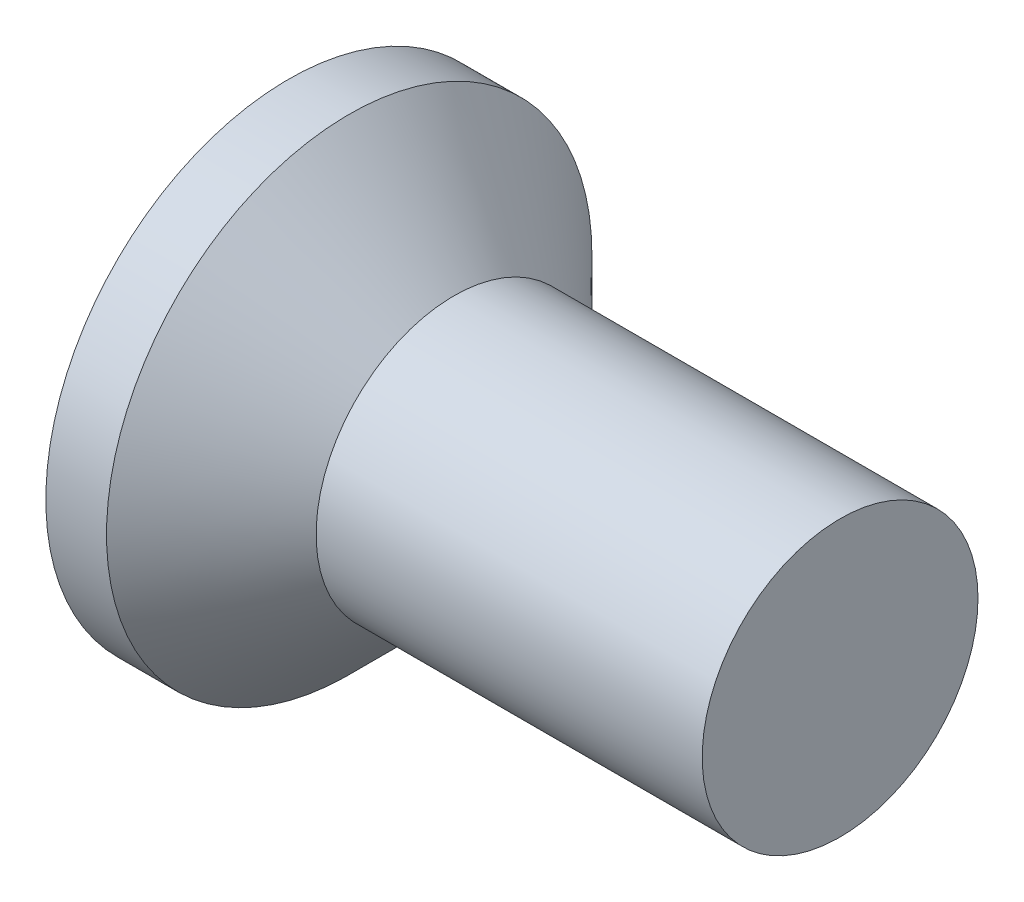
ISO-10303-21;
HEADER;
FILE_DESCRIPTION(('STEP AP214'),'2;1');
FILE_NAME('part.step','',(''),(''),'','','');
FILE_SCHEMA(('AUTOMOTIVE_DESIGN { 1 0 10303 214 1 1 1 1 }'));
ENDSEC;
DATA;
#1=APPLICATION_CONTEXT('core data for automotive mechanical design processes');
#2=APPLICATION_PROTOCOL_DEFINITION('international standard','automotive_design',2000,#1);
#3=PRODUCT_CONTEXT('',#1,'mechanical');
#4=PRODUCT('Part','Part','',(#3));
#5=PRODUCT_RELATED_PRODUCT_CATEGORY('part','',(#4));
#6=PRODUCT_DEFINITION_FORMATION('','',#4);
#7=PRODUCT_DEFINITION_CONTEXT('part definition',#1,'design');
#8=PRODUCT_DEFINITION('design','',#6,#7);
#9=PRODUCT_DEFINITION_SHAPE('','',#8);
#10=(LENGTH_UNIT() NAMED_UNIT(*) SI_UNIT(.MILLI.,.METRE.));
#11=(NAMED_UNIT(*) PLANE_ANGLE_UNIT() SI_UNIT($,.RADIAN.));
#12=(NAMED_UNIT(*) SI_UNIT($,.STERADIAN.) SOLID_ANGLE_UNIT());
#13=UNCERTAINTY_MEASURE_WITH_UNIT(LENGTH_MEASURE(1.E-05),#10,'distance_accuracy_value','');
#14=(GEOMETRIC_REPRESENTATION_CONTEXT(3) GLOBAL_UNCERTAINTY_ASSIGNED_CONTEXT((#13)) GLOBAL_UNIT_ASSIGNED_CONTEXT((#10,
#11,#12)) REPRESENTATION_CONTEXT('',''));
#15=CARTESIAN_POINT('',(0.,0.,0.));
#16=DIRECTION('',(0.,0.,1.));
#17=DIRECTION('',(1.,0.,0.));
#18=AXIS2_PLACEMENT_3D('',#15,#16,#17);
#19=CARTESIAN_POINT('',(0.,2.19999999999999,0.));
#20=DIRECTION('',(-1.,0.,0.));
#21=DIRECTION('',(0.,0.,1.));
#22=AXIS2_PLACEMENT_3D('',#19,#20,#21);
#23=PLANE('',#22);
#24=CARTESIAN_POINT('',(0.,0.,0.));
#25=DIRECTION('',(1.,0.,0.));
#26=DIRECTION('',(0.,0.,-1.));
#27=AXIS2_PLACEMENT_3D('',#24,#25,#26);
#28=CIRCLE('',#27,2.19999999999999);
#29=CARTESIAN_POINT('',(0.,0.,-2.20000000000004));
#30=VERTEX_POINT('',#29);
#31=EDGE_CURVE('E180',#30,#30,#28,.T.);
#32=ORIENTED_EDGE('',*,*,#31,.F.);
#33=EDGE_LOOP('',(#32));
#34=FACE_BOUND('',#33,.T.);
#35=DIRECTION('',(0.,1.,0.));
#36=VECTOR('',#35,1.);
#37=CARTESIAN_POINT('',(0.,-0.290000000000061,-0.289999999999957));
#38=LINE('',#37,#36);
#39=CARTESIAN_POINT('',(0.,-1.45000000000006,-0.289999999999957));
#40=VERTEX_POINT('',#39);
#41=CARTESIAN_POINT('',(0.,-0.590000000000018,-0.290000000000012));
#42=VERTEX_POINT('',#41);
#43=EDGE_CURVE('E284',#40,#42,#38,.T.);
#44=ORIENTED_EDGE('',*,*,#43,.T.);
#45=CARTESIAN_POINT('',(0.,-0.590000000000049,-0.589999999999952));
#46=DIRECTION('',(-1.,0.,0.));
#47=DIRECTION('',(0.,0.,1.));
#48=AXIS2_PLACEMENT_3D('',#45,#46,#47);
#49=CIRCLE('',#48,0.3);
#50=CARTESIAN_POINT('',(0.,-0.290000000000026,-0.590000000000035));
#51=VERTEX_POINT('',#50);
#52=EDGE_CURVE('E186',#42,#51,#49,.T.);
#53=ORIENTED_EDGE('',*,*,#52,.T.);
#54=DIRECTION('',(0.,0.,-1.));
#55=VECTOR('',#54,1.);
#56=CARTESIAN_POINT('',(0.,-0.290000000000061,-0.289999999999957));
#57=LINE('',#56,#55);
#58=CARTESIAN_POINT('',(0.,-0.290000000000026,-1.44999999999999));
#59=VERTEX_POINT('',#58);
#60=EDGE_CURVE('E279',#51,#59,#57,.T.);
#61=ORIENTED_EDGE('',*,*,#60,.T.);
#62=DIRECTION('',(0.,1.,0.));
#63=VECTOR('',#62,1.);
#64=CARTESIAN_POINT('',(0.,0.290000000000002,-1.45000000000002));
#65=LINE('',#64,#63);
#66=CARTESIAN_POINT('',(0.,0.290000000000002,-1.45000000000002));
#67=VERTEX_POINT('',#66);
#68=EDGE_CURVE('E243',#59,#67,#65,.T.);
#69=ORIENTED_EDGE('',*,*,#68,.T.);
#70=DIRECTION('',(0.,0.,1.));
#71=VECTOR('',#70,1.);
#72=CARTESIAN_POINT('',(0.,0.289999999999974,-0.289999999999943));
#73=LINE('',#72,#71);
#74=CARTESIAN_POINT('',(0.,0.289999999999964,-0.589999999999924));
#75=VERTEX_POINT('',#74);
#76=EDGE_CURVE('E233',#67,#75,#73,.T.);
#77=ORIENTED_EDGE('',*,*,#76,.T.);
#78=CARTESIAN_POINT('',(0.,0.589999999999969,-0.58999999999991));
#79=DIRECTION('',(-1.,0.,0.));
#80=DIRECTION('',(0.,0.,1.));
#81=AXIS2_PLACEMENT_3D('',#78,#79,#80);
#82=CIRCLE('',#81,0.3);
#83=CARTESIAN_POINT('',(0.,0.589999999999986,-0.290000000000026));
#84=VERTEX_POINT('',#83);
#85=EDGE_CURVE('E182',#75,#84,#82,.T.);
#86=ORIENTED_EDGE('',*,*,#85,.T.);
#87=DIRECTION('',(0.,1.,0.));
#88=VECTOR('',#87,1.);
#89=CARTESIAN_POINT('',(0.,0.289999999999974,-0.289999999999943));
#90=LINE('',#89,#88);
#91=CARTESIAN_POINT('',(0.,1.44999999999994,-0.289999999999985));
#92=VERTEX_POINT('',#91);
#93=EDGE_CURVE('E230',#84,#92,#90,.T.);
#94=ORIENTED_EDGE('',*,*,#93,.T.);
#95=DIRECTION('',(0.,0.,1.));
#96=VECTOR('',#95,1.);
#97=CARTESIAN_POINT('',(0.,1.44999999999994,-0.289999999999985));
#98=LINE('',#97,#96);
#99=CARTESIAN_POINT('',(0.,1.44999999999995,0.290000000000012));
#100=VERTEX_POINT('',#99);
#101=EDGE_CURVE('E239',#92,#100,#98,.T.);
#102=ORIENTED_EDGE('',*,*,#101,.T.);
#103=DIRECTION('',(0.,-1.00000000000001,0.));
#104=VECTOR('',#103,1.);
#105=CARTESIAN_POINT('',(0.,0.28999999999996,0.290000000000026));
#106=LINE('',#105,#104);
#107=CARTESIAN_POINT('',(0.,0.589999999999955,0.290000000000026));
#108=VERTEX_POINT('',#107);
#109=EDGE_CURVE('E241',#100,#108,#106,.T.);
#110=ORIENTED_EDGE('',*,*,#109,.T.);
#111=CARTESIAN_POINT('',(0.,0.589999999999976,0.590000000000021));
#112=DIRECTION('',(-1.,0.,0.));
#113=DIRECTION('',(0.,0.,1.));
#114=AXIS2_PLACEMENT_3D('',#111,#112,#113);
#115=CIRCLE('',#114,0.3);
#116=CARTESIAN_POINT('',(0.,0.289999999999978,0.589999999999993));
#117=VERTEX_POINT('',#116);
#118=EDGE_CURVE('E152',#108,#117,#115,.T.);
#119=ORIENTED_EDGE('',*,*,#118,.T.);
#120=DIRECTION('',(0.,0.,1.));
#121=VECTOR('',#120,1.);
#122=CARTESIAN_POINT('',(0.,0.28999999999996,0.290000000000026));
#123=LINE('',#122,#121);
#124=CARTESIAN_POINT('',(0.,0.289999999999981,1.45000000000001));
#125=VERTEX_POINT('',#124);
#126=EDGE_CURVE('E146',#117,#125,#123,.T.);
#127=ORIENTED_EDGE('',*,*,#126,.T.);
#128=DIRECTION('',(0.,-1.,0.));
#129=VECTOR('',#128,1.);
#130=CARTESIAN_POINT('',(0.,0.289999999999981,1.45000000000001));
#131=LINE('',#130,#129);
#132=CARTESIAN_POINT('',(0.,-0.290000000000068,1.45000000000003));
#133=VERTEX_POINT('',#132);
#134=EDGE_CURVE('E150',#125,#133,#131,.T.);
#135=ORIENTED_EDGE('',*,*,#134,.T.);
#136=DIRECTION('',(0.,0.,-1.));
#137=VECTOR('',#136,1.);
#138=CARTESIAN_POINT('',(0.,-0.290000000000037,0.290000000000068));
#139=LINE('',#138,#137);
#140=CARTESIAN_POINT('',(0.,-0.29000000000004,0.590000000000049));
#141=VERTEX_POINT('',#140);
#142=EDGE_CURVE('E162',#133,#141,#139,.T.);
#143=ORIENTED_EDGE('',*,*,#142,.T.);
#144=CARTESIAN_POINT('',(0.,-0.590000000000045,0.589999999999993));
#145=DIRECTION('',(-1.,0.,0.));
#146=DIRECTION('',(0.,0.,1.));
#147=AXIS2_PLACEMENT_3D('',#144,#145,#146);
#148=CIRCLE('',#147,0.3);
#149=CARTESIAN_POINT('',(0.,-0.590000000000077,0.289999999999999));
#150=VERTEX_POINT('',#149);
#151=EDGE_CURVE('E184',#141,#150,#148,.T.);
#152=ORIENTED_EDGE('',*,*,#151,.T.);
#153=DIRECTION('',(0.,-1.,0.));
#154=VECTOR('',#153,1.);
#155=CARTESIAN_POINT('',(0.,-0.290000000000037,0.290000000000068));
#156=LINE('',#155,#154);
#157=CARTESIAN_POINT('',(0.,-1.45,0.289999999999957));
#158=VERTEX_POINT('',#157);
#159=EDGE_CURVE('E291',#150,#158,#156,.T.);
#160=ORIENTED_EDGE('',*,*,#159,.T.);
#161=DIRECTION('',(0.,0.,-1.));
#162=VECTOR('',#161,1.);
#163=CARTESIAN_POINT('',(0.,-1.45000000000006,-0.289999999999957));
#164=LINE('',#163,#162);
#165=EDGE_CURVE('E288',#158,#40,#164,.T.);
#166=ORIENTED_EDGE('',*,*,#165,.T.);
#167=EDGE_LOOP('',(#44,#53,#61,#69,#77,#86,#94,#102,#110,#119,#127,#135,#143,#152,#160,#166));
#168=FACE_BOUND('',#167,.T.);
#169=ADVANCED_FACE('F34',(#34,#168),#23,.T.);
#170=CARTESIAN_POINT('',(4.99999999999999,1.24999999999996,0.));
#171=DIRECTION('',(1.,0.,0.));
#172=DIRECTION('',(0.,0.,-1.));
#173=AXIS2_PLACEMENT_3D('',#170,#171,#172);
#174=PLANE('',#173);
#175=CARTESIAN_POINT('',(4.99999999999999,0.,0.));
#176=DIRECTION('',(1.,0.,0.));
#177=DIRECTION('',(0.,0.,-1.));
#178=AXIS2_PLACEMENT_3D('',#175,#176,#177);
#179=CIRCLE('',#178,1.24999999999999);
#180=CARTESIAN_POINT('',(4.99999999999999,0.,-1.24999999999997));
#181=VERTEX_POINT('',#180);
#182=EDGE_CURVE('E167',#181,#181,#179,.T.);
#183=ORIENTED_EDGE('',*,*,#182,.T.);
#184=EDGE_LOOP('',(#183));
#185=FACE_BOUND('',#184,.T.);
#186=ADVANCED_FACE('F340',(#185),#174,.T.);
#187=CARTESIAN_POINT('',(4.51581291088132,0.,0.));
#188=DIRECTION('',(1.,0.,0.));
#189=DIRECTION('',(0.,0.,-1.));
#190=AXIS2_PLACEMENT_3D('',#187,#188,#189);
#191=CYLINDRICAL_SURFACE('',#190,2.19999999999999);
#192=ORIENTED_EDGE('',*,*,#31,.T.);
#193=EDGE_LOOP('',(#192));
#194=FACE_BOUND('',#193,.T.);
#195=CARTESIAN_POINT('',(0.550000000000002,0.,0.));
#196=DIRECTION('',(1.,0.,0.));
#197=DIRECTION('',(0.,0.,-1.));
#198=AXIS2_PLACEMENT_3D('',#195,#196,#197);
#199=CIRCLE('',#198,2.19999999999999);
#200=CARTESIAN_POINT('',(0.550000000000002,0.,-2.20000000000004));
#201=VERTEX_POINT('',#200);
#202=EDGE_CURVE('E250',#201,#201,#199,.T.);
#203=ORIENTED_EDGE('',*,*,#202,.F.);
#204=EDGE_LOOP('',(#203));
#205=FACE_BOUND('',#204,.T.);
#206=ADVANCED_FACE('F346',(#194,#205),#191,.T.);
#207=CARTESIAN_POINT('',(1.5,0.,0.));
#208=DIRECTION('',(-1.,0.,0.));
#209=DIRECTION('',(0.,0.,1.));
#210=AXIS2_PLACEMENT_3D('',#207,#208,#209);
#211=CONICAL_SURFACE('',#210,1.24999999999999,0.78539816339745);
#212=ORIENTED_EDGE('',*,*,#202,.T.);
#213=EDGE_LOOP('',(#212));
#214=FACE_BOUND('',#213,.T.);
#215=CARTESIAN_POINT('',(1.5,0.,0.));
#216=DIRECTION('',(1.,0.,0.));
#217=DIRECTION('',(0.,0.,-1.));
#218=AXIS2_PLACEMENT_3D('',#215,#216,#217);
#219=CIRCLE('',#218,1.24999999999999);
#220=CARTESIAN_POINT('',(1.5,0.,-1.25000000000003));
#221=VERTEX_POINT('',#220);
#222=EDGE_CURVE('E170',#221,#221,#219,.T.);
#223=ORIENTED_EDGE('',*,*,#222,.F.);
#224=EDGE_LOOP('',(#223));
#225=FACE_BOUND('',#224,.T.);
#226=ADVANCED_FACE('F485',(#214,#225),#211,.T.);
#227=CARTESIAN_POINT('',(4.51581291088132,0.,0.));
#228=DIRECTION('',(1.,0.,0.));
#229=DIRECTION('',(0.,0.,-1.));
#230=AXIS2_PLACEMENT_3D('',#227,#228,#229);
#231=CYLINDRICAL_SURFACE('',#230,1.24999999999999);
#232=ORIENTED_EDGE('',*,*,#182,.F.);
#233=EDGE_LOOP('',(#232));
#234=FACE_BOUND('',#233,.T.);
#235=ORIENTED_EDGE('',*,*,#222,.T.);
#236=EDGE_LOOP('',(#235));
#237=FACE_BOUND('',#236,.T.);
#238=ADVANCED_FACE('F475',(#234,#237),#231,.T.);
#239=CARTESIAN_POINT('',(0.750000000000001,0.289999999999954,0.29000000000004));
#240=DIRECTION('',(0.,-1.,0.));
#241=DIRECTION('',(0.,0.,-1.));
#242=AXIS2_PLACEMENT_3D('',#239,#240,#241);
#243=PLANE('',#242);
#244=ORIENTED_EDGE('',*,*,#126,.F.);
#245=DIRECTION('',(-1.,0.,0.));
#246=VECTOR('',#245,1.);
#247=CARTESIAN_POINT('',(0.750000000000001,0.289999999999978,0.589999999999993));
#248=LINE('',#247,#246);
#249=CARTESIAN_POINT('',(0.750000000000001,0.289999999999978,0.589999999999993));
#250=VERTEX_POINT('',#249);
#251=EDGE_CURVE('E49',#117,#250,#248,.F.);
#252=ORIENTED_EDGE('',*,*,#251,.T.);
#253=DIRECTION('',(0.,0.,1.));
#254=VECTOR('',#253,1.);
#255=CARTESIAN_POINT('',(0.750000000000001,0.289999999999954,0.29000000000004));
#256=LINE('',#255,#254);
#257=CARTESIAN_POINT('',(0.750000000000001,0.289999999999947,1.01698729810784));
#258=VERTEX_POINT('',#257);
#259=EDGE_CURVE('E165',#250,#258,#256,.T.);
#260=ORIENTED_EDGE('',*,*,#259,.T.);
#261=DIRECTION('',(-0.866025403784438,0.,0.500000000000002));
#262=VECTOR('',#261,1.);
#263=CARTESIAN_POINT('',(0.,0.289999999999981,1.45000000000001));
#264=LINE('',#263,#262);
#265=EDGE_CURVE('E158',#258,#125,#264,.T.);
#266=ORIENTED_EDGE('',*,*,#265,.T.);
#267=EDGE_LOOP('',(#244,#252,#260,#266));
#268=FACE_BOUND('',#267,.T.);
#269=ADVANCED_FACE('F164',(#268),#243,.T.);
#270=CARTESIAN_POINT('',(0.,0.289999999999981,1.45000000000001));
#271=DIRECTION('',(-0.500000000000001,0.,-0.866025403784442));
#272=DIRECTION('',(-0.866025403784438,0.,0.500000000000002));
#273=AXIS2_PLACEMENT_3D('',#270,#271,#272);
#274=PLANE('',#273);
#275=ORIENTED_EDGE('',*,*,#134,.F.);
#276=ORIENTED_EDGE('',*,*,#265,.F.);
#277=DIRECTION('',(0.,-1.,0.));
#278=VECTOR('',#277,1.);
#279=CARTESIAN_POINT('',(0.750000000000001,0.289999999999947,1.01698729810784));
#280=LINE('',#279,#278);
#281=CARTESIAN_POINT('',(0.750000000000001,-0.290000000000051,1.01698729810783));
#282=VERTEX_POINT('',#281);
#283=EDGE_CURVE('E176',#258,#282,#280,.T.);
#284=ORIENTED_EDGE('',*,*,#283,.T.);
#285=DIRECTION('',(-0.866025403784438,0.,0.500000000000002));
#286=VECTOR('',#285,1.);
#287=CARTESIAN_POINT('',(1.06479473419498,-0.290000000000047,0.835240473580898));
#288=LINE('',#287,#286);
#289=EDGE_CURVE('E160',#282,#133,#288,.T.);
#290=ORIENTED_EDGE('',*,*,#289,.T.);
#291=EDGE_LOOP('',(#275,#276,#284,#290));
#292=FACE_BOUND('',#291,.T.);
#293=ADVANCED_FACE('F157',(#292),#274,.T.);
#294=CARTESIAN_POINT('',(0.750000000000001,-0.290000000000037,0.290000000000068));
#295=DIRECTION('',(0.,1.,0.));
#296=DIRECTION('',(0.,0.,1.));
#297=AXIS2_PLACEMENT_3D('',#294,#295,#296);
#298=PLANE('',#297);
#299=DIRECTION('',(0.,0.,-1.));
#300=VECTOR('',#299,1.);
#301=CARTESIAN_POINT('',(0.750000000000001,-0.290000000000037,0.290000000000068));
#302=LINE('',#301,#300);
#303=CARTESIAN_POINT('',(0.750000000000001,-0.29000000000004,0.590000000000049));
#304=VERTEX_POINT('',#303);
#305=EDGE_CURVE('E300',#282,#304,#302,.T.);
#306=ORIENTED_EDGE('',*,*,#305,.T.);
#307=DIRECTION('',(-1.,0.,0.));
#308=VECTOR('',#307,1.);
#309=CARTESIAN_POINT('',(0.750000000000001,-0.29000000000004,0.590000000000049));
#310=LINE('',#309,#308);
#311=EDGE_CURVE('E190',#304,#141,#310,.T.);
#312=ORIENTED_EDGE('',*,*,#311,.T.);
#313=ORIENTED_EDGE('',*,*,#142,.F.);
#314=ORIENTED_EDGE('',*,*,#289,.F.);
#315=EDGE_LOOP('',(#306,#312,#313,#314));
#316=FACE_BOUND('',#315,.T.);
#317=ADVANCED_FACE('F305',(#316),#298,.T.);
#318=CARTESIAN_POINT('',(0.750000000000001,-0.290000000000037,0.290000000000068));
#319=DIRECTION('',(0.,0.,-1.));
#320=DIRECTION('',(0.,1.,0.));
#321=AXIS2_PLACEMENT_3D('',#318,#319,#320);
#322=PLANE('',#321);
#323=ORIENTED_EDGE('',*,*,#159,.F.);
#324=DIRECTION('',(-1.,0.,0.));
#325=VECTOR('',#324,1.);
#326=CARTESIAN_POINT('',(0.750000000000001,-0.590000000000077,0.289999999999999));
#327=LINE('',#326,#325);
#328=CARTESIAN_POINT('',(0.750000000000001,-0.590000000000077,0.289999999999999));
#329=VERTEX_POINT('',#328);
#330=EDGE_CURVE('E193',#150,#329,#327,.F.);
#331=ORIENTED_EDGE('',*,*,#330,.T.);
#332=DIRECTION('',(0.,-1.,0.));
#333=VECTOR('',#332,1.);
#334=CARTESIAN_POINT('',(0.750000000000001,-0.290000000000037,0.290000000000068));
#335=LINE('',#334,#333);
#336=CARTESIAN_POINT('',(0.750000000000001,-1.01698729810783,0.290000000000012));
#337=VERTEX_POINT('',#336);
#338=EDGE_CURVE('E261',#329,#337,#335,.T.);
#339=ORIENTED_EDGE('',*,*,#338,.T.);
#340=DIRECTION('',(-0.866025403784438,-0.500000000000003,0.));
#341=VECTOR('',#340,1.);
#342=CARTESIAN_POINT('',(0.,-1.45,0.289999999999957));
#343=LINE('',#342,#341);
#344=EDGE_CURVE('E172',#337,#158,#343,.T.);
#345=ORIENTED_EDGE('',*,*,#344,.T.);
#346=EDGE_LOOP('',(#323,#331,#339,#345));
#347=FACE_BOUND('',#346,.T.);
#348=ADVANCED_FACE('F315',(#347),#322,.T.);
#349=CARTESIAN_POINT('',(0.,-1.45000000000006,-0.289999999999957));
#350=DIRECTION('',(-0.500000000000001,0.866025403784442,0.));
#351=DIRECTION('',(-0.866025403784438,-0.500000000000003,0.));
#352=AXIS2_PLACEMENT_3D('',#349,#350,#351);
#353=PLANE('',#352);
#354=ORIENTED_EDGE('',*,*,#165,.F.);
#355=ORIENTED_EDGE('',*,*,#344,.F.);
#356=DIRECTION('',(0.,0.,-1.));
#357=VECTOR('',#356,1.);
#358=CARTESIAN_POINT('',(0.750000000000001,-1.01698729810785,-0.289999999999957));
#359=LINE('',#358,#357);
#360=CARTESIAN_POINT('',(0.750000000000001,-1.01698729810785,-0.289999999999957));
#361=VERTEX_POINT('',#360);
#362=EDGE_CURVE('E258',#337,#361,#359,.T.);
#363=ORIENTED_EDGE('',*,*,#362,.T.);
#364=DIRECTION('',(-0.866025403784438,-0.500000000000003,0.));
#365=VECTOR('',#364,1.);
#366=CARTESIAN_POINT('',(1.06479473419498,-0.83524047358088,-0.289999999999999));
#367=LINE('',#366,#365);
#368=EDGE_CURVE('E255',#361,#40,#367,.T.);
#369=ORIENTED_EDGE('',*,*,#368,.T.);
#370=EDGE_LOOP('',(#354,#355,#363,#369));
#371=FACE_BOUND('',#370,.T.);
#372=ADVANCED_FACE('F319',(#371),#353,.T.);
#373=CARTESIAN_POINT('',(0.750000000000001,-0.290000000000061,-0.289999999999957));
#374=DIRECTION('',(0.,0.,1.));
#375=DIRECTION('',(1.,0.,0.));
#376=AXIS2_PLACEMENT_3D('',#373,#374,#375);
#377=PLANE('',#376);
#378=DIRECTION('',(0.,1.,0.));
#379=VECTOR('',#378,1.);
#380=CARTESIAN_POINT('',(0.750000000000001,-0.290000000000061,-0.289999999999957));
#381=LINE('',#380,#379);
#382=CARTESIAN_POINT('',(0.750000000000001,-0.590000000000018,-0.290000000000012));
#383=VERTEX_POINT('',#382);
#384=EDGE_CURVE('E260',#361,#383,#381,.T.);
#385=ORIENTED_EDGE('',*,*,#384,.T.);
#386=DIRECTION('',(-1.,0.,0.));
#387=VECTOR('',#386,1.);
#388=CARTESIAN_POINT('',(0.750000000000001,-0.590000000000018,-0.290000000000012));
#389=LINE('',#388,#387);
#390=EDGE_CURVE('E177',#383,#42,#389,.T.);
#391=ORIENTED_EDGE('',*,*,#390,.T.);
#392=ORIENTED_EDGE('',*,*,#43,.F.);
#393=ORIENTED_EDGE('',*,*,#368,.F.);
#394=EDGE_LOOP('',(#385,#391,#392,#393));
#395=FACE_BOUND('',#394,.T.);
#396=ADVANCED_FACE('F323',(#395),#377,.T.);
#397=CARTESIAN_POINT('',(0.750000000000001,-0.290000000000061,-0.289999999999957));
#398=DIRECTION('',(0.,1.,0.));
#399=DIRECTION('',(0.,0.,1.));
#400=AXIS2_PLACEMENT_3D('',#397,#398,#399);
#401=PLANE('',#400);
#402=ORIENTED_EDGE('',*,*,#60,.F.);
#403=DIRECTION('',(-1.,0.,0.));
#404=VECTOR('',#403,1.);
#405=CARTESIAN_POINT('',(0.750000000000001,-0.290000000000026,-0.590000000000035));
#406=LINE('',#405,#404);
#407=CARTESIAN_POINT('',(0.750000000000001,-0.290000000000026,-0.590000000000035));
#408=VERTEX_POINT('',#407);
#409=EDGE_CURVE('E188',#51,#408,#406,.F.);
#410=ORIENTED_EDGE('',*,*,#409,.T.);
#411=DIRECTION('',(0.,0.,-1.));
#412=VECTOR('',#411,1.);
#413=CARTESIAN_POINT('',(0.750000000000001,-0.290000000000061,-0.289999999999957));
#414=LINE('',#413,#412);
#415=CARTESIAN_POINT('',(0.750000000000004,-0.290000000000068,-1.01698729810774));
#416=VERTEX_POINT('',#415);
#417=EDGE_CURVE('E272',#408,#416,#414,.T.);
#418=ORIENTED_EDGE('',*,*,#417,.T.);
#419=DIRECTION('',(-0.866025403784438,0.,-0.500000000000003));
#420=VECTOR('',#419,1.);
#421=CARTESIAN_POINT('',(0.,-0.290000000000026,-1.44999999999999));
#422=LINE('',#421,#420);
#423=EDGE_CURVE('E257',#416,#59,#422,.T.);
#424=ORIENTED_EDGE('',*,*,#423,.T.);
#425=EDGE_LOOP('',(#402,#410,#418,#424));
#426=FACE_BOUND('',#425,.T.);
#427=ADVANCED_FACE('F278',(#426),#401,.T.);
#428=CARTESIAN_POINT('',(0.,0.290000000000002,-1.45000000000002));
#429=DIRECTION('',(-0.500000000000001,0.,0.866025403784441));
#430=DIRECTION('',(0.866025403784438,0.,0.500000000000003));
#431=AXIS2_PLACEMENT_3D('',#428,#429,#430);
#432=PLANE('',#431);
#433=ORIENTED_EDGE('',*,*,#68,.F.);
#434=ORIENTED_EDGE('',*,*,#423,.F.);
#435=DIRECTION('',(0.,1.,0.));
#436=VECTOR('',#435,1.);
#437=CARTESIAN_POINT('',(0.750000000000004,0.289999999999967,-1.01698729810774));
#438=LINE('',#437,#436);
#439=CARTESIAN_POINT('',(0.750000000000004,0.289999999999967,-1.01698729810774));
#440=VERTEX_POINT('',#439);
#441=EDGE_CURVE('E225',#416,#440,#438,.T.);
#442=ORIENTED_EDGE('',*,*,#441,.T.);
#443=DIRECTION('',(-0.866025403784438,0.,-0.500000000000003));
#444=VECTOR('',#443,1.);
#445=CARTESIAN_POINT('',(1.06479473419498,0.28999999999996,-0.835240473580759));
#446=LINE('',#445,#444);
#447=EDGE_CURVE('E224',#440,#67,#446,.T.);
#448=ORIENTED_EDGE('',*,*,#447,.T.);
#449=EDGE_LOOP('',(#433,#434,#442,#448));
#450=FACE_BOUND('',#449,.T.);
#451=ADVANCED_FACE('F283',(#450),#432,.T.);
#452=CARTESIAN_POINT('',(0.750000000000004,0.289999999999957,-0.289999999999971));
#453=DIRECTION('',(0.,-1.,0.));
#454=DIRECTION('',(0.,0.,-1.));
#455=AXIS2_PLACEMENT_3D('',#452,#453,#454);
#456=PLANE('',#455);
#457=DIRECTION('',(0.,0.,1.));
#458=VECTOR('',#457,1.);
#459=CARTESIAN_POINT('',(0.750000000000004,0.289999999999957,-0.289999999999971));
#460=LINE('',#459,#458);
#461=CARTESIAN_POINT('',(0.750000000000004,0.289999999999947,-0.589999999999952));
#462=VERTEX_POINT('',#461);
#463=EDGE_CURVE('E213',#440,#462,#460,.T.);
#464=ORIENTED_EDGE('',*,*,#463,.T.);
#465=DIRECTION('',(-1.,0.,0.));
#466=VECTOR('',#465,1.);
#467=CARTESIAN_POINT('',(0.750000000000004,0.289999999999947,-0.589999999999952));
#468=LINE('',#467,#466);
#469=EDGE_CURVE('E195',#462,#75,#468,.T.);
#470=ORIENTED_EDGE('',*,*,#469,.T.);
#471=ORIENTED_EDGE('',*,*,#76,.F.);
#472=ORIENTED_EDGE('',*,*,#447,.F.);
#473=EDGE_LOOP('',(#464,#470,#471,#472));
#474=FACE_BOUND('',#473,.T.);
#475=ADVANCED_FACE('F221',(#474),#456,.T.);
#476=CARTESIAN_POINT('',(0.750000000000004,0.289999999999957,-0.289999999999971));
#477=DIRECTION('',(0.,0.,1.));
#478=DIRECTION('',(1.,0.,0.));
#479=AXIS2_PLACEMENT_3D('',#476,#477,#478);
#480=PLANE('',#479);
#481=ORIENTED_EDGE('',*,*,#93,.F.);
#482=DIRECTION('',(-1.,0.,0.));
#483=VECTOR('',#482,1.);
#484=CARTESIAN_POINT('',(0.750000000000004,0.589999999999986,-0.290000000000026));
#485=LINE('',#484,#483);
#486=CARTESIAN_POINT('',(0.750000000000004,0.589999999999986,-0.290000000000026));
#487=VERTEX_POINT('',#486);
#488=EDGE_CURVE('E198',#84,#487,#485,.F.);
#489=ORIENTED_EDGE('',*,*,#488,.T.);
#490=DIRECTION('',(0.,1.,0.));
#491=VECTOR('',#490,1.);
#492=CARTESIAN_POINT('',(0.750000000000004,0.289999999999957,-0.289999999999971));
#493=LINE('',#492,#491);
#494=CARTESIAN_POINT('',(0.750000000000004,1.01698729810774,-0.289999999999943));
#495=VERTEX_POINT('',#494);
#496=EDGE_CURVE('E215',#487,#495,#493,.T.);
#497=ORIENTED_EDGE('',*,*,#496,.T.);
#498=DIRECTION('',(-0.866025403784438,0.500000000000004,0.));
#499=VECTOR('',#498,1.);
#500=CARTESIAN_POINT('',(0.,1.44999999999994,-0.289999999999985));
#501=LINE('',#500,#499);
#502=EDGE_CURVE('E237',#495,#92,#501,.T.);
#503=ORIENTED_EDGE('',*,*,#502,.T.);
#504=EDGE_LOOP('',(#481,#489,#497,#503));
#505=FACE_BOUND('',#504,.T.);
#506=ADVANCED_FACE('F235',(#505),#480,.T.);
#507=CARTESIAN_POINT('',(0.,1.44999999999994,-0.289999999999985));
#508=DIRECTION('',(-0.500000000000001,-0.866025403784443,0.));
#509=DIRECTION('',(0.866025403784438,-0.500000000000004,0.));
#510=AXIS2_PLACEMENT_3D('',#507,#508,#509);
#511=PLANE('',#510);
#512=ORIENTED_EDGE('',*,*,#101,.F.);
#513=ORIENTED_EDGE('',*,*,#502,.F.);
#514=DIRECTION('',(0.,0.,1.));
#515=VECTOR('',#514,1.);
#516=CARTESIAN_POINT('',(0.750000000000004,1.01698729810774,-0.289999999999943));
#517=LINE('',#516,#515);
#518=CARTESIAN_POINT('',(0.750000000000001,1.01698729810774,0.29000000000004));
#519=VERTEX_POINT('',#518);
#520=EDGE_CURVE('E267',#495,#519,#517,.T.);
#521=ORIENTED_EDGE('',*,*,#520,.T.);
#522=DIRECTION('',(-0.866025403784438,0.500000000000004,0.));
#523=VECTOR('',#522,1.);
#524=CARTESIAN_POINT('',(1.06479473419498,0.835240473580818,0.29000000000004));
#525=LINE('',#524,#523);
#526=EDGE_CURVE('E264',#519,#100,#525,.T.);
#527=ORIENTED_EDGE('',*,*,#526,.T.);
#528=EDGE_LOOP('',(#512,#513,#521,#527));
#529=FACE_BOUND('',#528,.T.);
#530=ADVANCED_FACE('F358',(#529),#511,.T.);
#531=CARTESIAN_POINT('',(0.750000000000001,0.289999999999954,0.29000000000004));
#532=DIRECTION('',(0.,0.,-1.));
#533=DIRECTION('',(0.,1.00000000000001,0.));
#534=AXIS2_PLACEMENT_3D('',#531,#532,#533);
#535=PLANE('',#534);
#536=DIRECTION('',(0.,-1.00000000000001,0.));
#537=VECTOR('',#536,1.);
#538=CARTESIAN_POINT('',(0.750000000000001,0.289999999999954,0.29000000000004));
#539=LINE('',#538,#537);
#540=CARTESIAN_POINT('',(0.750000000000001,0.589999999999948,0.290000000000012));
#541=VERTEX_POINT('',#540);
#542=EDGE_CURVE('E266',#519,#541,#539,.T.);
#543=ORIENTED_EDGE('',*,*,#542,.T.);
#544=DIRECTION('',(-1.,0.,0.));
#545=VECTOR('',#544,1.);
#546=CARTESIAN_POINT('',(0.750000000000001,0.589999999999948,0.290000000000012));
#547=LINE('',#546,#545);
#548=EDGE_CURVE('E200',#541,#108,#547,.T.);
#549=ORIENTED_EDGE('',*,*,#548,.T.);
#550=ORIENTED_EDGE('',*,*,#109,.F.);
#551=ORIENTED_EDGE('',*,*,#526,.F.);
#552=EDGE_LOOP('',(#543,#549,#550,#551));
#553=FACE_BOUND('',#552,.T.);
#554=ADVANCED_FACE('F336',(#553),#535,.T.);
#555=CARTESIAN_POINT('',(0.750000000000001,0.289999999999954,0.29000000000004));
#556=DIRECTION('',(1.,0.,0.));
#557=DIRECTION('',(0.,0.,-1.));
#558=AXIS2_PLACEMENT_3D('',#555,#556,#557);
#559=PLANE('',#558);
#560=ORIENTED_EDGE('',*,*,#259,.F.);
#561=CARTESIAN_POINT('',(0.750000000000001,0.589999999999962,0.590000000000049));
#562=DIRECTION('',(1.,0.,0.));
#563=DIRECTION('',(0.,0.,-1.));
#564=AXIS2_PLACEMENT_3D('',#561,#562,#563);
#565=CIRCLE('',#564,0.3);
#566=EDGE_CURVE('E11',#250,#541,#565,.T.);
#567=ORIENTED_EDGE('',*,*,#566,.T.);
#568=ORIENTED_EDGE('',*,*,#542,.F.);
#569=ORIENTED_EDGE('',*,*,#520,.F.);
#570=ORIENTED_EDGE('',*,*,#496,.F.);
#571=CARTESIAN_POINT('',(0.750000000000004,0.589999999999934,-0.589999999999952));
#572=DIRECTION('',(1.,0.,0.));
#573=DIRECTION('',(0.,0.,-1.));
#574=AXIS2_PLACEMENT_3D('',#571,#572,#573);
#575=CIRCLE('',#574,0.3);
#576=EDGE_CURVE('E42',#487,#462,#575,.T.);
#577=ORIENTED_EDGE('',*,*,#576,.T.);
#578=ORIENTED_EDGE('',*,*,#463,.F.);
#579=ORIENTED_EDGE('',*,*,#441,.F.);
#580=ORIENTED_EDGE('',*,*,#417,.F.);
#581=CARTESIAN_POINT('',(0.750000000000001,-0.590000000000035,-0.589999999999952));
#582=DIRECTION('',(1.,0.,0.));
#583=DIRECTION('',(0.,0.,-1.));
#584=AXIS2_PLACEMENT_3D('',#581,#582,#583);
#585=CIRCLE('',#584,0.3);
#586=EDGE_CURVE('E204',#408,#383,#585,.T.);
#587=ORIENTED_EDGE('',*,*,#586,.T.);
#588=ORIENTED_EDGE('',*,*,#384,.F.);
#589=ORIENTED_EDGE('',*,*,#362,.F.);
#590=ORIENTED_EDGE('',*,*,#338,.F.);
#591=CARTESIAN_POINT('',(0.750000000000001,-0.590000000000007,0.589999999999966));
#592=DIRECTION('',(1.,0.,0.));
#593=DIRECTION('',(0.,0.,-1.));
#594=AXIS2_PLACEMENT_3D('',#591,#592,#593);
#595=CIRCLE('',#594,0.3);
#596=EDGE_CURVE('E206',#329,#304,#595,.T.);
#597=ORIENTED_EDGE('',*,*,#596,.T.);
#598=ORIENTED_EDGE('',*,*,#305,.F.);
#599=ORIENTED_EDGE('',*,*,#283,.F.);
#600=EDGE_LOOP('',(#560,#567,#568,#569,#570,#577,#578,#579,#580,#587,#588,#589,#590,#597,#598,#599));
#601=FACE_BOUND('',#600,.T.);
#602=ADVANCED_FACE('F211',(#601),#559,.F.);
#603=CARTESIAN_POINT('',(0.750000000000001,-0.590000000000035,-0.589999999999952));
#604=DIRECTION('',(-1.,0.,0.));
#605=DIRECTION('',(0.,0.,1.));
#606=AXIS2_PLACEMENT_3D('',#603,#604,#605);
#607=CYLINDRICAL_SURFACE('',#606,0.3);
#608=ORIENTED_EDGE('',*,*,#586,.F.);
#609=ORIENTED_EDGE('',*,*,#409,.F.);
#610=ORIENTED_EDGE('',*,*,#52,.F.);
#611=ORIENTED_EDGE('',*,*,#390,.F.);
#612=EDGE_LOOP('',(#608,#609,#610,#611));
#613=FACE_BOUND('',#612,.T.);
#614=ADVANCED_FACE('F328',(#613),#607,.T.);
#615=CARTESIAN_POINT('',(0.750000000000001,-0.590000000000007,0.589999999999966));
#616=DIRECTION('',(-1.,0.,0.));
#617=DIRECTION('',(0.,0.,1.));
#618=AXIS2_PLACEMENT_3D('',#615,#616,#617);
#619=CYLINDRICAL_SURFACE('',#618,0.3);
#620=ORIENTED_EDGE('',*,*,#596,.F.);
#621=ORIENTED_EDGE('',*,*,#330,.F.);
#622=ORIENTED_EDGE('',*,*,#151,.F.);
#623=ORIENTED_EDGE('',*,*,#311,.F.);
#624=EDGE_LOOP('',(#620,#621,#622,#623));
#625=FACE_BOUND('',#624,.T.);
#626=ADVANCED_FACE('F312',(#625),#619,.T.);
#627=CARTESIAN_POINT('',(0.750000000000004,0.589999999999934,-0.589999999999952));
#628=DIRECTION('',(-1.,0.,0.));
#629=DIRECTION('',(0.,0.,1.));
#630=AXIS2_PLACEMENT_3D('',#627,#628,#629);
#631=CYLINDRICAL_SURFACE('',#630,0.3);
#632=ORIENTED_EDGE('',*,*,#576,.F.);
#633=ORIENTED_EDGE('',*,*,#488,.F.);
#634=ORIENTED_EDGE('',*,*,#85,.F.);
#635=ORIENTED_EDGE('',*,*,#469,.F.);
#636=EDGE_LOOP('',(#632,#633,#634,#635));
#637=FACE_BOUND('',#636,.T.);
#638=ADVANCED_FACE('F227',(#637),#631,.T.);
#639=CARTESIAN_POINT('',(0.750000000000001,0.589999999999962,0.590000000000049));
#640=DIRECTION('',(-1.,0.,0.));
#641=DIRECTION('',(0.,0.,1.));
#642=AXIS2_PLACEMENT_3D('',#639,#640,#641);
#643=CYLINDRICAL_SURFACE('',#642,0.3);
#644=ORIENTED_EDGE('',*,*,#566,.F.);
#645=ORIENTED_EDGE('',*,*,#251,.F.);
#646=ORIENTED_EDGE('',*,*,#118,.F.);
#647=ORIENTED_EDGE('',*,*,#548,.F.);
#648=EDGE_LOOP('',(#644,#645,#646,#647));
#649=FACE_BOUND('',#648,.T.);
#650=ADVANCED_FACE('F36',(#649),#643,.T.);
#651=CLOSED_SHELL('',(#169,#186,#206,#226,#238,#269,#293,#317,#348,#372,#396,#427,#451,#475,
#506,#530,#554,#602,#614,#626,#638,#650));
#652=MANIFOLD_SOLID_BREP('B2',#651);
#653=ADVANCED_BREP_SHAPE_REPRESENTATION('',(#18,#652),#14);
#654=SHAPE_DEFINITION_REPRESENTATION(#9,#653);
ENDSEC;
END-ISO-10303-21;
